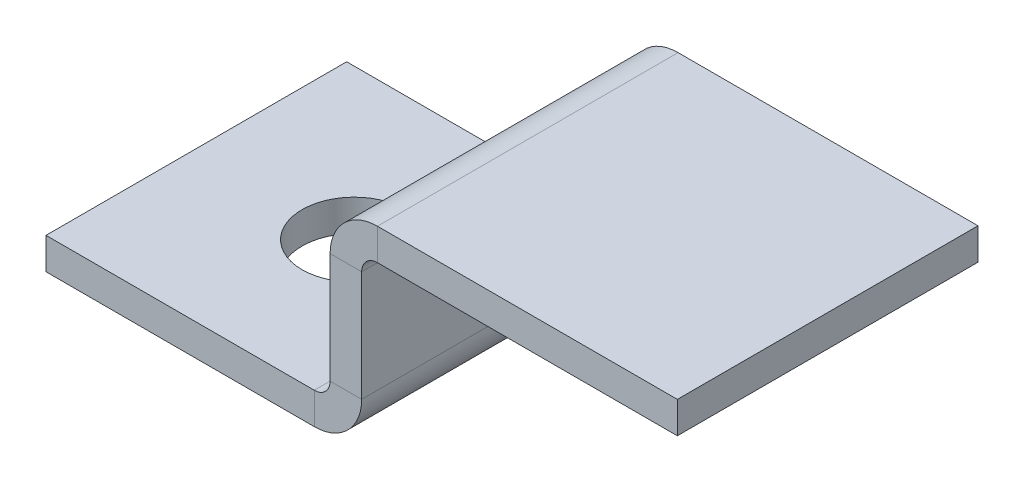
ISO-10303-21;
HEADER;
FILE_DESCRIPTION(('STEP AP214'),'2;1');
FILE_NAME('part.step','',(''),(''),'','','');
FILE_SCHEMA(('AUTOMOTIVE_DESIGN { 1 0 10303 214 1 1 1 1 }'));
ENDSEC;
DATA;
#1=APPLICATION_CONTEXT('core data for automotive mechanical design processes');
#2=APPLICATION_PROTOCOL_DEFINITION('international standard','automotive_design',2000,#1);
#3=PRODUCT_CONTEXT('',#1,'mechanical');
#4=PRODUCT('Part','Part','',(#3));
#5=PRODUCT_RELATED_PRODUCT_CATEGORY('part','',(#4));
#6=PRODUCT_DEFINITION_FORMATION('','',#4);
#7=PRODUCT_DEFINITION_CONTEXT('part definition',#1,'design');
#8=PRODUCT_DEFINITION('design','',#6,#7);
#9=PRODUCT_DEFINITION_SHAPE('','',#8);
#10=(LENGTH_UNIT() NAMED_UNIT(*) SI_UNIT(.MILLI.,.METRE.));
#11=(NAMED_UNIT(*) PLANE_ANGLE_UNIT() SI_UNIT($,.RADIAN.));
#12=(NAMED_UNIT(*) SI_UNIT($,.STERADIAN.) SOLID_ANGLE_UNIT());
#13=UNCERTAINTY_MEASURE_WITH_UNIT(LENGTH_MEASURE(1.E-05),#10,'distance_accuracy_value','');
#14=(GEOMETRIC_REPRESENTATION_CONTEXT(3) GLOBAL_UNCERTAINTY_ASSIGNED_CONTEXT((#13)) GLOBAL_UNIT_ASSIGNED_CONTEXT((#10,
#11,#12)) REPRESENTATION_CONTEXT('',''));
#15=CARTESIAN_POINT('',(0.,0.,0.));
#16=DIRECTION('',(0.,0.,1.));
#17=DIRECTION('',(1.,0.,0.));
#18=AXIS2_PLACEMENT_3D('',#15,#16,#17);
#19=CARTESIAN_POINT('',(-3.,0.,9.525));
#20=DIRECTION('',(0.,0.,1.));
#21=DIRECTION('',(1.,0.,0.));
#22=AXIS2_PLACEMENT_3D('',#19,#20,#21);
#23=PLANE('',#22);
#24=DIRECTION('',(0.,1.,0.));
#25=VECTOR('',#24,1.);
#26=CARTESIAN_POINT('',(-3.,0.,9.525));
#27=LINE('',#26,#25);
#28=CARTESIAN_POINT('',(-3.,0.,9.525));
#29=VERTEX_POINT('',#28);
#30=CARTESIAN_POINT('',(-3.,2.,9.525));
#31=VERTEX_POINT('',#30);
#32=EDGE_CURVE('E11',#29,#31,#27,.T.);
#33=ORIENTED_EDGE('',*,*,#32,.F.);
#34=CARTESIAN_POINT('',(-3.,3.,9.525));
#35=DIRECTION('',(0.,0.,-1.));
#36=DIRECTION('',(-1.,0.,0.));
#37=AXIS2_PLACEMENT_3D('',#34,#35,#36);
#38=CIRCLE('',#37,3.);
#39=CARTESIAN_POINT('',(0.,3.,9.525));
#40=VERTEX_POINT('',#39);
#41=EDGE_CURVE('E246',#40,#29,#38,.T.);
#42=ORIENTED_EDGE('',*,*,#41,.F.);
#43=DIRECTION('',(1.,0.,0.));
#44=VECTOR('',#43,1.);
#45=CARTESIAN_POINT('',(-2.,3.,9.525));
#46=LINE('',#45,#44);
#47=CARTESIAN_POINT('',(-2.,3.,9.525));
#48=VERTEX_POINT('',#47);
#49=EDGE_CURVE('E48',#48,#40,#46,.T.);
#50=ORIENTED_EDGE('',*,*,#49,.F.);
#51=CARTESIAN_POINT('',(-3.,3.,9.525));
#52=DIRECTION('',(0.,0.,1.));
#53=DIRECTION('',(1.,0.,0.));
#54=AXIS2_PLACEMENT_3D('',#51,#52,#53);
#55=CIRCLE('',#54,1.);
#56=EDGE_CURVE('E172',#48,#31,#55,.F.);
#57=ORIENTED_EDGE('',*,*,#56,.T.);
#58=EDGE_LOOP('',(#33,#42,#50,#57));
#59=FACE_BOUND('',#58,.T.);
#60=ADVANCED_FACE('F40',(#59),#23,.T.);
#61=CARTESIAN_POINT('',(-2.,3.,9.525));
#62=DIRECTION('',(0.,0.,1.));
#63=DIRECTION('',(1.,0.,0.));
#64=AXIS2_PLACEMENT_3D('',#61,#62,#63);
#65=PLANE('',#64);
#66=DIRECTION('',(-1.,0.,0.));
#67=VECTOR('',#66,1.);
#68=CARTESIAN_POINT('',(0.,0.,9.525));
#69=LINE('',#68,#67);
#70=CARTESIAN_POINT('',(-20.,0.,9.525));
#71=VERTEX_POINT('',#70);
#72=EDGE_CURVE('E250',#29,#71,#69,.T.);
#73=ORIENTED_EDGE('',*,*,#72,.F.);
#74=ORIENTED_EDGE('',*,*,#32,.T.);
#75=DIRECTION('',(-1.,0.,0.));
#76=VECTOR('',#75,1.);
#77=CARTESIAN_POINT('',(0.,2.,9.525));
#78=LINE('',#77,#76);
#79=CARTESIAN_POINT('',(-20.,2.,9.525));
#80=VERTEX_POINT('',#79);
#81=EDGE_CURVE('E108',#31,#80,#78,.T.);
#82=ORIENTED_EDGE('',*,*,#81,.T.);
#83=DIRECTION('',(0.,1.,0.));
#84=VECTOR('',#83,1.);
#85=CARTESIAN_POINT('',(-20.,0.,9.525));
#86=LINE('',#85,#84);
#87=EDGE_CURVE('E483',#71,#80,#86,.T.);
#88=ORIENTED_EDGE('',*,*,#87,.F.);
#89=EDGE_LOOP('',(#73,#74,#82,#88));
#90=FACE_BOUND('',#89,.T.);
#91=ADVANCED_FACE('F299',(#90),#65,.T.);
#92=CARTESIAN_POINT('',(0.,3.,-9.525));
#93=DIRECTION('',(0.,0.,-1.));
#94=DIRECTION('',(-1.,0.,0.));
#95=AXIS2_PLACEMENT_3D('',#92,#93,#94);
#96=PLANE('',#95);
#97=DIRECTION('',(-1.,0.,0.));
#98=VECTOR('',#97,1.);
#99=CARTESIAN_POINT('',(0.,3.,-9.525));
#100=LINE('',#99,#98);
#101=CARTESIAN_POINT('',(0.,3.,-9.525));
#102=VERTEX_POINT('',#101);
#103=CARTESIAN_POINT('',(-2.,3.,-9.525));
#104=VERTEX_POINT('',#103);
#105=EDGE_CURVE('E95',#102,#104,#100,.T.);
#106=ORIENTED_EDGE('',*,*,#105,.F.);
#107=CARTESIAN_POINT('',(-3.,3.,-9.525));
#108=DIRECTION('',(0.,0.,-1.));
#109=DIRECTION('',(-1.,0.,0.));
#110=AXIS2_PLACEMENT_3D('',#107,#108,#109);
#111=CIRCLE('',#110,3.);
#112=CARTESIAN_POINT('',(-3.,0.,-9.525));
#113=VERTEX_POINT('',#112);
#114=EDGE_CURVE('E188',#102,#113,#111,.T.);
#115=ORIENTED_EDGE('',*,*,#114,.T.);
#116=DIRECTION('',(0.,-1.,0.));
#117=VECTOR('',#116,1.);
#118=CARTESIAN_POINT('',(-3.,2.,-9.525));
#119=LINE('',#118,#117);
#120=CARTESIAN_POINT('',(-3.,2.,-9.525));
#121=VERTEX_POINT('',#120);
#122=EDGE_CURVE('E102',#121,#113,#119,.T.);
#123=ORIENTED_EDGE('',*,*,#122,.F.);
#124=CARTESIAN_POINT('',(-3.,3.,-9.525));
#125=DIRECTION('',(0.,0.,1.));
#126=DIRECTION('',(1.,0.,0.));
#127=AXIS2_PLACEMENT_3D('',#124,#125,#126);
#128=CIRCLE('',#127,1.);
#129=EDGE_CURVE('E207',#104,#121,#128,.F.);
#130=ORIENTED_EDGE('',*,*,#129,.F.);
#131=EDGE_LOOP('',(#106,#115,#123,#130));
#132=FACE_BOUND('',#131,.T.);
#133=ADVANCED_FACE('F303',(#132),#96,.T.);
#134=CARTESIAN_POINT('',(-3.,2.,-9.525));
#135=DIRECTION('',(0.,0.,-1.));
#136=DIRECTION('',(-1.,0.,0.));
#137=AXIS2_PLACEMENT_3D('',#134,#135,#136);
#138=PLANE('',#137);
#139=DIRECTION('',(0.,-1.,0.));
#140=VECTOR('',#139,1.);
#141=CARTESIAN_POINT('',(0.,11.,-9.525));
#142=LINE('',#141,#140);
#143=CARTESIAN_POINT('',(0.,10.,-9.525));
#144=VERTEX_POINT('',#143);
#145=EDGE_CURVE('E190',#144,#102,#142,.T.);
#146=ORIENTED_EDGE('',*,*,#145,.T.);
#147=ORIENTED_EDGE('',*,*,#105,.T.);
#148=DIRECTION('',(0.,-1.,0.));
#149=VECTOR('',#148,1.);
#150=CARTESIAN_POINT('',(-2.,11.,-9.525));
#151=LINE('',#150,#149);
#152=CARTESIAN_POINT('',(-2.,10.,-9.525));
#153=VERTEX_POINT('',#152);
#154=EDGE_CURVE('E205',#153,#104,#151,.T.);
#155=ORIENTED_EDGE('',*,*,#154,.F.);
#156=DIRECTION('',(1.,0.,0.));
#157=VECTOR('',#156,1.);
#158=CARTESIAN_POINT('',(-2.,10.,-9.525));
#159=LINE('',#158,#157);
#160=EDGE_CURVE('E233',#153,#144,#159,.T.);
#161=ORIENTED_EDGE('',*,*,#160,.T.);
#162=EDGE_LOOP('',(#146,#147,#155,#161));
#163=FACE_BOUND('',#162,.T.);
#164=ADVANCED_FACE('F276',(#163),#138,.T.);
#165=CARTESIAN_POINT('',(0.,10.,9.525));
#166=DIRECTION('',(0.,0.,1.));
#167=DIRECTION('',(1.,0.,0.));
#168=AXIS2_PLACEMENT_3D('',#165,#166,#167);
#169=PLANE('',#168);
#170=DIRECTION('',(-1.,0.,0.));
#171=VECTOR('',#170,1.);
#172=CARTESIAN_POINT('',(0.,10.,9.525));
#173=LINE('',#172,#171);
#174=CARTESIAN_POINT('',(0.,10.,9.525));
#175=VERTEX_POINT('',#174);
#176=CARTESIAN_POINT('',(-2.,10.,9.525));
#177=VERTEX_POINT('',#176);
#178=EDGE_CURVE('E136',#175,#177,#173,.T.);
#179=ORIENTED_EDGE('',*,*,#178,.F.);
#180=CARTESIAN_POINT('',(1.,10.,9.525));
#181=DIRECTION('',(0.,0.,1.));
#182=DIRECTION('',(1.,0.,0.));
#183=AXIS2_PLACEMENT_3D('',#180,#181,#182);
#184=CIRCLE('',#183,1.);
#185=CARTESIAN_POINT('',(1.,11.,9.525));
#186=VERTEX_POINT('',#185);
#187=EDGE_CURVE('E253',#186,#175,#184,.T.);
#188=ORIENTED_EDGE('',*,*,#187,.F.);
#189=DIRECTION('',(0.,-1.,0.));
#190=VECTOR('',#189,1.);
#191=CARTESIAN_POINT('',(1.,13.,9.525));
#192=LINE('',#191,#190);
#193=CARTESIAN_POINT('',(1.,13.,9.525));
#194=VERTEX_POINT('',#193);
#195=EDGE_CURVE('E148',#194,#186,#192,.T.);
#196=ORIENTED_EDGE('',*,*,#195,.F.);
#197=CARTESIAN_POINT('',(1.,10.,9.525));
#198=DIRECTION('',(0.,0.,1.));
#199=DIRECTION('',(1.,0.,0.));
#200=AXIS2_PLACEMENT_3D('',#197,#198,#199);
#201=CIRCLE('',#200,3.);
#202=EDGE_CURVE('E151',#194,#177,#201,.T.);
#203=ORIENTED_EDGE('',*,*,#202,.T.);
#204=EDGE_LOOP('',(#179,#188,#196,#203));
#205=FACE_BOUND('',#204,.T.);
#206=ADVANCED_FACE('F153',(#205),#169,.T.);
#207=CARTESIAN_POINT('',(1.,13.,9.525));
#208=DIRECTION('',(0.,0.,1.));
#209=DIRECTION('',(1.,0.,0.));
#210=AXIS2_PLACEMENT_3D('',#207,#208,#209);
#211=PLANE('',#210);
#212=DIRECTION('',(0.,-1.,0.));
#213=VECTOR('',#212,1.);
#214=CARTESIAN_POINT('',(0.,11.,9.525));
#215=LINE('',#214,#213);
#216=EDGE_CURVE('E143',#175,#40,#215,.T.);
#217=ORIENTED_EDGE('',*,*,#216,.F.);
#218=ORIENTED_EDGE('',*,*,#178,.T.);
#219=DIRECTION('',(0.,-1.,0.));
#220=VECTOR('',#219,1.);
#221=CARTESIAN_POINT('',(-2.,11.,9.525));
#222=LINE('',#221,#220);
#223=EDGE_CURVE('E140',#177,#48,#222,.T.);
#224=ORIENTED_EDGE('',*,*,#223,.T.);
#225=ORIENTED_EDGE('',*,*,#49,.T.);
#226=EDGE_LOOP('',(#217,#218,#224,#225));
#227=FACE_BOUND('',#226,.T.);
#228=ADVANCED_FACE('F138',(#227),#211,.T.);
#229=CARTESIAN_POINT('',(1.,11.,-9.525));
#230=DIRECTION('',(0.,0.,-1.));
#231=DIRECTION('',(-1.,0.,0.));
#232=AXIS2_PLACEMENT_3D('',#229,#230,#231);
#233=PLANE('',#232);
#234=DIRECTION('',(0.,1.,0.));
#235=VECTOR('',#234,1.);
#236=CARTESIAN_POINT('',(1.,11.,-9.525));
#237=LINE('',#236,#235);
#238=CARTESIAN_POINT('',(1.,11.,-9.525));
#239=VERTEX_POINT('',#238);
#240=CARTESIAN_POINT('',(1.,13.,-9.525));
#241=VERTEX_POINT('',#240);
#242=EDGE_CURVE('E235',#239,#241,#237,.T.);
#243=ORIENTED_EDGE('',*,*,#242,.F.);
#244=CARTESIAN_POINT('',(1.,10.,-9.525));
#245=DIRECTION('',(0.,0.,1.));
#246=DIRECTION('',(1.,0.,0.));
#247=AXIS2_PLACEMENT_3D('',#244,#245,#246);
#248=CIRCLE('',#247,1.);
#249=EDGE_CURVE('E192',#239,#144,#248,.T.);
#250=ORIENTED_EDGE('',*,*,#249,.T.);
#251=ORIENTED_EDGE('',*,*,#160,.F.);
#252=CARTESIAN_POINT('',(1.,10.,-9.525));
#253=DIRECTION('',(0.,0.,1.));
#254=DIRECTION('',(1.,0.,0.));
#255=AXIS2_PLACEMENT_3D('',#252,#253,#254);
#256=CIRCLE('',#255,3.);
#257=EDGE_CURVE('E164',#241,#153,#256,.T.);
#258=ORIENTED_EDGE('',*,*,#257,.F.);
#259=EDGE_LOOP('',(#243,#250,#251,#258));
#260=FACE_BOUND('',#259,.T.);
#261=ADVANCED_FACE('F274',(#260),#233,.T.);
#262=CARTESIAN_POINT('',(-2.,10.,-9.525));
#263=DIRECTION('',(0.,0.,-1.));
#264=DIRECTION('',(-1.,0.,0.));
#265=AXIS2_PLACEMENT_3D('',#262,#263,#264);
#266=PLANE('',#265);
#267=DIRECTION('',(-1.,0.,0.));
#268=VECTOR('',#267,1.);
#269=CARTESIAN_POINT('',(0.,11.,-9.525));
#270=LINE('',#269,#268);
#271=CARTESIAN_POINT('',(20.,11.,-9.525));
#272=VERTEX_POINT('',#271);
#273=EDGE_CURVE('E195',#272,#239,#270,.T.);
#274=ORIENTED_EDGE('',*,*,#273,.T.);
#275=ORIENTED_EDGE('',*,*,#242,.T.);
#276=DIRECTION('',(1.,0.,0.));
#277=VECTOR('',#276,1.);
#278=CARTESIAN_POINT('',(0.,13.,-9.525));
#279=LINE('',#278,#277);
#280=CARTESIAN_POINT('',(20.,13.,-9.525));
#281=VERTEX_POINT('',#280);
#282=EDGE_CURVE('E201',#281,#241,#279,.F.);
#283=ORIENTED_EDGE('',*,*,#282,.F.);
#284=DIRECTION('',(0.,-1.,0.));
#285=VECTOR('',#284,1.);
#286=CARTESIAN_POINT('',(20.,13.,-9.525));
#287=LINE('',#286,#285);
#288=EDGE_CURVE('E198',#281,#272,#287,.T.);
#289=ORIENTED_EDGE('',*,*,#288,.T.);
#290=EDGE_LOOP('',(#274,#275,#283,#289));
#291=FACE_BOUND('',#290,.T.);
#292=ADVANCED_FACE('F286',(#291),#266,.T.);
#293=CARTESIAN_POINT('',(0.,2.,9.525));
#294=DIRECTION('',(0.,-1.,0.));
#295=DIRECTION('',(1.,0.,0.));
#296=AXIS2_PLACEMENT_3D('',#293,#294,#295);
#297=PLANE('',#296);
#298=CARTESIAN_POINT('',(-10.,2.,0.));
#299=DIRECTION('',(0.,1.,0.));
#300=DIRECTION('',(0.,0.,1.));
#301=AXIS2_PLACEMENT_3D('',#298,#299,#300);
#302=CIRCLE('',#301,3.29999999999999);
#303=CARTESIAN_POINT('',(-10.,2.,3.29999999999999));
#304=VERTEX_POINT('',#303);
#305=EDGE_CURVE('E478',#304,#304,#302,.T.);
#306=ORIENTED_EDGE('',*,*,#305,.F.);
#307=EDGE_LOOP('',(#306));
#308=FACE_BOUND('',#307,.T.);
#309=DIRECTION('',(-1.,0.,0.));
#310=VECTOR('',#309,1.);
#311=CARTESIAN_POINT('',(0.,2.,-9.525));
#312=LINE('',#311,#310);
#313=CARTESIAN_POINT('',(-20.,2.,-9.525));
#314=VERTEX_POINT('',#313);
#315=EDGE_CURVE('E178',#121,#314,#312,.T.);
#316=ORIENTED_EDGE('',*,*,#315,.T.);
#317=DIRECTION('',(0.,0.,-1.));
#318=VECTOR('',#317,1.);
#319=CARTESIAN_POINT('',(-20.,2.,9.525));
#320=LINE('',#319,#318);
#321=EDGE_CURVE('E231',#80,#314,#320,.T.);
#322=ORIENTED_EDGE('',*,*,#321,.F.);
#323=ORIENTED_EDGE('',*,*,#81,.F.);
#324=DIRECTION('',(0.,0.,-1.));
#325=VECTOR('',#324,1.);
#326=CARTESIAN_POINT('',(-3.,2.,9.525));
#327=LINE('',#326,#325);
#328=EDGE_CURVE('E174',#31,#121,#327,.T.);
#329=ORIENTED_EDGE('',*,*,#328,.T.);
#330=EDGE_LOOP('',(#316,#322,#323,#329));
#331=FACE_BOUND('',#330,.T.);
#332=ADVANCED_FACE('F288',(#308,#331),#297,.F.);
#333=CARTESIAN_POINT('',(-20.,0.,9.525));
#334=DIRECTION('',(-1.,0.,0.));
#335=DIRECTION('',(0.,0.,1.));
#336=AXIS2_PLACEMENT_3D('',#333,#334,#335);
#337=PLANE('',#336);
#338=DIRECTION('',(0.,1.,0.));
#339=VECTOR('',#338,1.);
#340=CARTESIAN_POINT('',(-20.,0.,-9.525));
#341=LINE('',#340,#339);
#342=CARTESIAN_POINT('',(-20.,0.,-9.525));
#343=VERTEX_POINT('',#342);
#344=EDGE_CURVE('E181',#343,#314,#341,.T.);
#345=ORIENTED_EDGE('',*,*,#344,.F.);
#346=DIRECTION('',(0.,0.,-1.));
#347=VECTOR('',#346,1.);
#348=CARTESIAN_POINT('',(-20.,0.,9.525));
#349=LINE('',#348,#347);
#350=EDGE_CURVE('E229',#71,#343,#349,.T.);
#351=ORIENTED_EDGE('',*,*,#350,.F.);
#352=ORIENTED_EDGE('',*,*,#87,.T.);
#353=ORIENTED_EDGE('',*,*,#321,.T.);
#354=EDGE_LOOP('',(#345,#351,#352,#353));
#355=FACE_BOUND('',#354,.T.);
#356=ADVANCED_FACE('F294',(#355),#337,.T.);
#357=CARTESIAN_POINT('',(0.,0.,9.525));
#358=DIRECTION('',(0.,-1.,0.));
#359=DIRECTION('',(1.,0.,0.));
#360=AXIS2_PLACEMENT_3D('',#357,#358,#359);
#361=PLANE('',#360);
#362=CARTESIAN_POINT('',(-10.,0.,0.));
#363=DIRECTION('',(0.,-1.,0.));
#364=DIRECTION('',(1.,0.,0.));
#365=AXIS2_PLACEMENT_3D('',#362,#363,#364);
#366=CIRCLE('',#365,3.29999999999999);
#367=CARTESIAN_POINT('',(-6.70000000000001,0.,0.));
#368=VERTEX_POINT('',#367);
#369=EDGE_CURVE('E182',#368,#368,#366,.T.);
#370=ORIENTED_EDGE('',*,*,#369,.F.);
#371=EDGE_LOOP('',(#370));
#372=FACE_BOUND('',#371,.T.);
#373=DIRECTION('',(-1.,0.,0.));
#374=VECTOR('',#373,1.);
#375=CARTESIAN_POINT('',(0.,0.,-9.525));
#376=LINE('',#375,#374);
#377=EDGE_CURVE('E185',#113,#343,#376,.T.);
#378=ORIENTED_EDGE('',*,*,#377,.F.);
#379=DIRECTION('',(0.,0.,-1.));
#380=VECTOR('',#379,1.);
#381=CARTESIAN_POINT('',(-3.,0.,9.525));
#382=LINE('',#381,#380);
#383=EDGE_CURVE('E226',#29,#113,#382,.T.);
#384=ORIENTED_EDGE('',*,*,#383,.F.);
#385=ORIENTED_EDGE('',*,*,#72,.T.);
#386=ORIENTED_EDGE('',*,*,#350,.T.);
#387=EDGE_LOOP('',(#378,#384,#385,#386));
#388=FACE_BOUND('',#387,.T.);
#389=ADVANCED_FACE('F338',(#372,#388),#361,.T.);
#390=CARTESIAN_POINT('',(-3.,3.,9.525));
#391=DIRECTION('',(0.,0.,-1.));
#392=DIRECTION('',(-1.,0.,0.));
#393=AXIS2_PLACEMENT_3D('',#390,#391,#392);
#394=CYLINDRICAL_SURFACE('',#393,3.);
#395=ORIENTED_EDGE('',*,*,#114,.F.);
#396=DIRECTION('',(0.,0.,-1.));
#397=VECTOR('',#396,1.);
#398=CARTESIAN_POINT('',(0.,3.,9.525));
#399=LINE('',#398,#397);
#400=EDGE_CURVE('E223',#40,#102,#399,.T.);
#401=ORIENTED_EDGE('',*,*,#400,.F.);
#402=ORIENTED_EDGE('',*,*,#41,.T.);
#403=ORIENTED_EDGE('',*,*,#383,.T.);
#404=EDGE_LOOP('',(#395,#401,#402,#403));
#405=FACE_BOUND('',#404,.T.);
#406=ADVANCED_FACE('F245',(#405),#394,.T.);
#407=CARTESIAN_POINT('',(0.,11.,9.525));
#408=DIRECTION('',(1.,0.,0.));
#409=DIRECTION('',(0.,1.,0.));
#410=AXIS2_PLACEMENT_3D('',#407,#408,#409);
#411=PLANE('',#410);
#412=ORIENTED_EDGE('',*,*,#145,.F.);
#413=DIRECTION('',(0.,0.,-1.));
#414=VECTOR('',#413,1.);
#415=CARTESIAN_POINT('',(0.,10.,9.525));
#416=LINE('',#415,#414);
#417=EDGE_CURVE('E220',#175,#144,#416,.T.);
#418=ORIENTED_EDGE('',*,*,#417,.F.);
#419=ORIENTED_EDGE('',*,*,#216,.T.);
#420=ORIENTED_EDGE('',*,*,#400,.T.);
#421=EDGE_LOOP('',(#412,#418,#419,#420));
#422=FACE_BOUND('',#421,.T.);
#423=ADVANCED_FACE('F252',(#422),#411,.T.);
#424=CARTESIAN_POINT('',(1.,10.,9.525));
#425=DIRECTION('',(0.,0.,-1.));
#426=DIRECTION('',(-1.,0.,0.));
#427=AXIS2_PLACEMENT_3D('',#424,#425,#426);
#428=CYLINDRICAL_SURFACE('',#427,1.);
#429=ORIENTED_EDGE('',*,*,#249,.F.);
#430=DIRECTION('',(0.,0.,-1.));
#431=VECTOR('',#430,1.);
#432=CARTESIAN_POINT('',(1.,11.,9.525));
#433=LINE('',#432,#431);
#434=EDGE_CURVE('E217',#186,#239,#433,.T.);
#435=ORIENTED_EDGE('',*,*,#434,.F.);
#436=ORIENTED_EDGE('',*,*,#187,.T.);
#437=ORIENTED_EDGE('',*,*,#417,.T.);
#438=EDGE_LOOP('',(#429,#435,#436,#437));
#439=FACE_BOUND('',#438,.T.);
#440=ADVANCED_FACE('F278',(#439),#428,.F.);
#441=CARTESIAN_POINT('',(0.,11.,9.525));
#442=DIRECTION('',(0.,-1.,0.));
#443=DIRECTION('',(0.,0.,-1.));
#444=AXIS2_PLACEMENT_3D('',#441,#442,#443);
#445=PLANE('',#444);
#446=ORIENTED_EDGE('',*,*,#273,.F.);
#447=DIRECTION('',(0.,0.,-1.));
#448=VECTOR('',#447,1.);
#449=CARTESIAN_POINT('',(20.,11.,9.525));
#450=LINE('',#449,#448);
#451=CARTESIAN_POINT('',(20.,11.,9.525));
#452=VERTEX_POINT('',#451);
#453=EDGE_CURVE('E215',#452,#272,#450,.T.);
#454=ORIENTED_EDGE('',*,*,#453,.F.);
#455=DIRECTION('',(-1.,0.,0.));
#456=VECTOR('',#455,1.);
#457=CARTESIAN_POINT('',(0.,11.,9.525));
#458=LINE('',#457,#456);
#459=EDGE_CURVE('E255',#452,#186,#458,.T.);
#460=ORIENTED_EDGE('',*,*,#459,.T.);
#461=ORIENTED_EDGE('',*,*,#434,.T.);
#462=EDGE_LOOP('',(#446,#454,#460,#461));
#463=FACE_BOUND('',#462,.T.);
#464=ADVANCED_FACE('F281',(#463),#445,.T.);
#465=CARTESIAN_POINT('',(20.,13.,9.525));
#466=DIRECTION('',(1.,0.,0.));
#467=DIRECTION('',(0.,0.,-1.));
#468=AXIS2_PLACEMENT_3D('',#465,#466,#467);
#469=PLANE('',#468);
#470=ORIENTED_EDGE('',*,*,#288,.F.);
#471=DIRECTION('',(0.,0.,-1.));
#472=VECTOR('',#471,1.);
#473=CARTESIAN_POINT('',(20.,13.,9.525));
#474=LINE('',#473,#472);
#475=CARTESIAN_POINT('',(20.,13.,9.525));
#476=VERTEX_POINT('',#475);
#477=EDGE_CURVE('E213',#476,#281,#474,.T.);
#478=ORIENTED_EDGE('',*,*,#477,.F.);
#479=DIRECTION('',(0.,-1.,0.));
#480=VECTOR('',#479,1.);
#481=CARTESIAN_POINT('',(20.,13.,9.525));
#482=LINE('',#481,#480);
#483=EDGE_CURVE('E261',#476,#452,#482,.T.);
#484=ORIENTED_EDGE('',*,*,#483,.T.);
#485=ORIENTED_EDGE('',*,*,#453,.T.);
#486=EDGE_LOOP('',(#470,#478,#484,#485));
#487=FACE_BOUND('',#486,.T.);
#488=ADVANCED_FACE('F284',(#487),#469,.T.);
#489=CARTESIAN_POINT('',(0.,13.,9.525));
#490=DIRECTION('',(0.,-1.,0.));
#491=DIRECTION('',(0.,0.,-1.));
#492=AXIS2_PLACEMENT_3D('',#489,#490,#491);
#493=PLANE('',#492);
#494=ORIENTED_EDGE('',*,*,#282,.T.);
#495=DIRECTION('',(0.,0.,-1.));
#496=VECTOR('',#495,1.);
#497=CARTESIAN_POINT('',(1.,13.,9.525));
#498=LINE('',#497,#496);
#499=EDGE_CURVE('E166',#194,#241,#498,.T.);
#500=ORIENTED_EDGE('',*,*,#499,.F.);
#501=DIRECTION('',(1.,0.,0.));
#502=VECTOR('',#501,1.);
#503=CARTESIAN_POINT('',(0.,13.,9.525));
#504=LINE('',#503,#502);
#505=EDGE_CURVE('E157',#476,#194,#504,.F.);
#506=ORIENTED_EDGE('',*,*,#505,.F.);
#507=ORIENTED_EDGE('',*,*,#477,.T.);
#508=EDGE_LOOP('',(#494,#500,#506,#507));
#509=FACE_BOUND('',#508,.T.);
#510=ADVANCED_FACE('F271',(#509),#493,.F.);
#511=CARTESIAN_POINT('',(1.,10.,9.525));
#512=DIRECTION('',(0.,0.,-1.));
#513=DIRECTION('',(-1.,0.,0.));
#514=AXIS2_PLACEMENT_3D('',#511,#512,#513);
#515=CYLINDRICAL_SURFACE('',#514,3.);
#516=ORIENTED_EDGE('',*,*,#257,.T.);
#517=DIRECTION('',(0.,0.,-1.));
#518=VECTOR('',#517,1.);
#519=CARTESIAN_POINT('',(-2.,10.,9.525));
#520=LINE('',#519,#518);
#521=EDGE_CURVE('E161',#177,#153,#520,.T.);
#522=ORIENTED_EDGE('',*,*,#521,.F.);
#523=ORIENTED_EDGE('',*,*,#202,.F.);
#524=ORIENTED_EDGE('',*,*,#499,.T.);
#525=EDGE_LOOP('',(#516,#522,#523,#524));
#526=FACE_BOUND('',#525,.T.);
#527=ADVANCED_FACE('F162',(#526),#515,.T.);
#528=CARTESIAN_POINT('',(-2.,11.,9.525));
#529=DIRECTION('',(1.,0.,0.));
#530=DIRECTION('',(0.,1.,0.));
#531=AXIS2_PLACEMENT_3D('',#528,#529,#530);
#532=PLANE('',#531);
#533=ORIENTED_EDGE('',*,*,#154,.T.);
#534=DIRECTION('',(0.,0.,-1.));
#535=VECTOR('',#534,1.);
#536=CARTESIAN_POINT('',(-2.,3.,9.525));
#537=LINE('',#536,#535);
#538=EDGE_CURVE('E167',#48,#104,#537,.T.);
#539=ORIENTED_EDGE('',*,*,#538,.F.);
#540=ORIENTED_EDGE('',*,*,#223,.F.);
#541=ORIENTED_EDGE('',*,*,#521,.T.);
#542=EDGE_LOOP('',(#533,#539,#540,#541));
#543=FACE_BOUND('',#542,.T.);
#544=ADVANCED_FACE('F169',(#543),#532,.F.);
#545=CARTESIAN_POINT('',(-3.,3.,9.525));
#546=DIRECTION('',(0.,0.,-1.));
#547=DIRECTION('',(-1.,0.,0.));
#548=AXIS2_PLACEMENT_3D('',#545,#546,#547);
#549=CYLINDRICAL_SURFACE('',#548,1.);
#550=ORIENTED_EDGE('',*,*,#129,.T.);
#551=ORIENTED_EDGE('',*,*,#328,.F.);
#552=ORIENTED_EDGE('',*,*,#56,.F.);
#553=ORIENTED_EDGE('',*,*,#538,.T.);
#554=EDGE_LOOP('',(#550,#551,#552,#553));
#555=FACE_BOUND('',#554,.T.);
#556=ADVANCED_FACE('F414',(#555),#549,.F.);
#557=CARTESIAN_POINT('',(-3.,3.,9.525));
#558=DIRECTION('',(0.,0.,-1.));
#559=DIRECTION('',(-1.,0.,0.));
#560=AXIS2_PLACEMENT_3D('',#557,#558,#559);
#561=PLANE('',#560);
#562=ORIENTED_EDGE('',*,*,#505,.T.);
#563=ORIENTED_EDGE('',*,*,#195,.T.);
#564=ORIENTED_EDGE('',*,*,#459,.F.);
#565=ORIENTED_EDGE('',*,*,#483,.F.);
#566=EDGE_LOOP('',(#562,#563,#564,#565));
#567=FACE_BOUND('',#566,.T.);
#568=ADVANCED_FACE('F267',(#567),#561,.F.);
#569=CARTESIAN_POINT('',(-3.,3.,-9.525));
#570=DIRECTION('',(0.,0.,-1.));
#571=DIRECTION('',(-1.,0.,0.));
#572=AXIS2_PLACEMENT_3D('',#569,#570,#571);
#573=PLANE('',#572);
#574=ORIENTED_EDGE('',*,*,#315,.F.);
#575=ORIENTED_EDGE('',*,*,#122,.T.);
#576=ORIENTED_EDGE('',*,*,#377,.T.);
#577=ORIENTED_EDGE('',*,*,#344,.T.);
#578=EDGE_LOOP('',(#574,#575,#576,#577));
#579=FACE_BOUND('',#578,.T.);
#580=ADVANCED_FACE('F434',(#579),#573,.T.);
#581=CARTESIAN_POINT('',(-10.,2.,0.));
#582=DIRECTION('',(0.,1.,0.));
#583=DIRECTION('',(0.,0.,1.));
#584=AXIS2_PLACEMENT_3D('',#581,#582,#583);
#585=CYLINDRICAL_SURFACE('',#584,3.29999999999999);
#586=ORIENTED_EDGE('',*,*,#369,.T.);
#587=EDGE_LOOP('',(#586));
#588=FACE_BOUND('',#587,.T.);
#589=ORIENTED_EDGE('',*,*,#305,.T.);
#590=EDGE_LOOP('',(#589));
#591=FACE_BOUND('',#590,.T.);
#592=ADVANCED_FACE('F444',(#588,#591),#585,.F.);
#593=CLOSED_SHELL('',(#60,#91,#133,#164,#206,#228,#261,#292,#332,#356,#389,#406,#423,#440,#464,
#488,#510,#527,#544,#556,#568,#580,#592));
#594=MANIFOLD_SOLID_BREP('B2',#593);
#595=ADVANCED_BREP_SHAPE_REPRESENTATION('',(#18,#594),#14);
#596=SHAPE_DEFINITION_REPRESENTATION(#9,#595);
ENDSEC;
END-ISO-10303-21;
